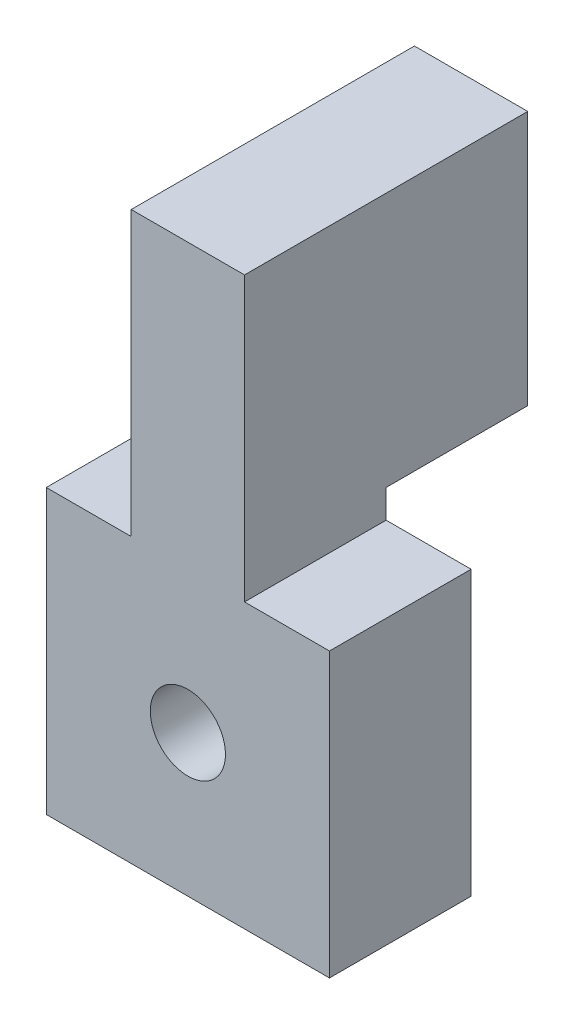
ISO-10303-21;
HEADER;
FILE_DESCRIPTION(('STEP AP214'),'2;1');
FILE_NAME('part.step','',(''),(''),'','','');
FILE_SCHEMA(('AUTOMOTIVE_DESIGN { 1 0 10303 214 1 1 1 1 }'));
ENDSEC;
DATA;
#1=APPLICATION_CONTEXT('core data for automotive mechanical design processes');
#2=APPLICATION_PROTOCOL_DEFINITION('international standard','automotive_design',2000,#1);
#3=PRODUCT_CONTEXT('',#1,'mechanical');
#4=PRODUCT('Part','Part','',(#3));
#5=PRODUCT_RELATED_PRODUCT_CATEGORY('part','',(#4));
#6=PRODUCT_DEFINITION_FORMATION('','',#4);
#7=PRODUCT_DEFINITION_CONTEXT('part definition',#1,'design');
#8=PRODUCT_DEFINITION('design','',#6,#7);
#9=PRODUCT_DEFINITION_SHAPE('','',#8);
#10=(LENGTH_UNIT() NAMED_UNIT(*) SI_UNIT(.MILLI.,.METRE.));
#11=(NAMED_UNIT(*) PLANE_ANGLE_UNIT() SI_UNIT($,.RADIAN.));
#12=(NAMED_UNIT(*) SI_UNIT($,.STERADIAN.) SOLID_ANGLE_UNIT());
#13=UNCERTAINTY_MEASURE_WITH_UNIT(LENGTH_MEASURE(1.E-05),#10,'distance_accuracy_value','');
#14=(GEOMETRIC_REPRESENTATION_CONTEXT(3) GLOBAL_UNCERTAINTY_ASSIGNED_CONTEXT((#13)) GLOBAL_UNIT_ASSIGNED_CONTEXT((#10,
#11,#12)) REPRESENTATION_CONTEXT('',''));
#15=CARTESIAN_POINT('',(0.,0.,0.));
#16=DIRECTION('',(0.,0.,1.));
#17=DIRECTION('',(1.,0.,0.));
#18=AXIS2_PLACEMENT_3D('',#15,#16,#17);
#19=CARTESIAN_POINT('',(10.,0.,10.));
#20=DIRECTION('',(1.,0.,0.));
#21=DIRECTION('',(0.,1.,0.));
#22=AXIS2_PLACEMENT_3D('',#19,#20,#21);
#23=PLANE('',#22);
#24=DIRECTION('',(0.,-1.,0.));
#25=VECTOR('',#24,1.);
#26=CARTESIAN_POINT('',(10.,0.,0.));
#27=LINE('',#26,#25);
#28=CARTESIAN_POINT('',(10.,10.,0.));
#29=VERTEX_POINT('',#28);
#30=CARTESIAN_POINT('',(10.,-10.,0.));
#31=VERTEX_POINT('',#30);
#32=EDGE_CURVE('E164',#29,#31,#27,.T.);
#33=ORIENTED_EDGE('',*,*,#32,.F.);
#34=DIRECTION('',(0.,0.,-1.));
#35=VECTOR('',#34,1.);
#36=CARTESIAN_POINT('',(10.,10.,10.));
#37=LINE('',#36,#35);
#38=CARTESIAN_POINT('',(10.,10.,10.));
#39=VERTEX_POINT('',#38);
#40=EDGE_CURVE('E11',#39,#29,#37,.T.);
#41=ORIENTED_EDGE('',*,*,#40,.F.);
#42=DIRECTION('',(0.,-1.,0.));
#43=VECTOR('',#42,1.);
#44=CARTESIAN_POINT('',(10.,0.,10.));
#45=LINE('',#44,#43);
#46=CARTESIAN_POINT('',(10.,-10.,10.));
#47=VERTEX_POINT('',#46);
#48=EDGE_CURVE('E149',#39,#47,#45,.T.);
#49=ORIENTED_EDGE('',*,*,#48,.T.);
#50=DIRECTION('',(0.,0.,-1.));
#51=VECTOR('',#50,1.);
#52=CARTESIAN_POINT('',(10.,-10.,10.));
#53=LINE('',#52,#51);
#54=EDGE_CURVE('E91',#47,#31,#53,.T.);
#55=ORIENTED_EDGE('',*,*,#54,.T.);
#56=EDGE_LOOP('',(#33,#41,#49,#55));
#57=FACE_BOUND('',#56,.T.);
#58=ADVANCED_FACE('F47',(#57),#23,.T.);
#59=CARTESIAN_POINT('',(0.,10.,10.));
#60=DIRECTION('',(0.,1.,0.));
#61=DIRECTION('',(-1.,0.,0.));
#62=AXIS2_PLACEMENT_3D('',#59,#60,#61);
#63=PLANE('',#62);
#64=DIRECTION('',(1.,0.,0.));
#65=VECTOR('',#64,1.);
#66=CARTESIAN_POINT('',(0.,10.,0.));
#67=LINE('',#66,#65);
#68=CARTESIAN_POINT('',(4.,10.,0.));
#69=VERTEX_POINT('',#68);
#70=EDGE_CURVE('E238',#69,#29,#67,.T.);
#71=ORIENTED_EDGE('',*,*,#70,.F.);
#72=DIRECTION('',(0.,0.,-1.));
#73=VECTOR('',#72,1.);
#74=CARTESIAN_POINT('',(4.,10.,10.));
#75=LINE('',#74,#73);
#76=CARTESIAN_POINT('',(4.,10.,10.));
#77=VERTEX_POINT('',#76);
#78=EDGE_CURVE('E55',#77,#69,#75,.T.);
#79=ORIENTED_EDGE('',*,*,#78,.F.);
#80=DIRECTION('',(1.,0.,0.));
#81=VECTOR('',#80,1.);
#82=CARTESIAN_POINT('',(0.,10.,10.));
#83=LINE('',#82,#81);
#84=EDGE_CURVE('E140',#77,#39,#83,.T.);
#85=ORIENTED_EDGE('',*,*,#84,.T.);
#86=ORIENTED_EDGE('',*,*,#40,.T.);
#87=EDGE_LOOP('',(#71,#79,#85,#86));
#88=FACE_BOUND('',#87,.T.);
#89=ADVANCED_FACE('F239',(#88),#63,.T.);
#90=CARTESIAN_POINT('',(4.,0.,10.));
#91=DIRECTION('',(1.,0.,0.));
#92=DIRECTION('',(0.,1.,0.));
#93=AXIS2_PLACEMENT_3D('',#90,#91,#92);
#94=PLANE('',#93);
#95=DIRECTION('',(0.,-1.,0.));
#96=VECTOR('',#95,1.);
#97=CARTESIAN_POINT('',(4.,10.,0.));
#98=LINE('',#97,#96);
#99=CARTESIAN_POINT('',(4.,12.,0.));
#100=VERTEX_POINT('',#99);
#101=EDGE_CURVE('E181',#100,#69,#98,.T.);
#102=ORIENTED_EDGE('',*,*,#101,.F.);
#103=DIRECTION('',(0.,0.,-1.));
#104=VECTOR('',#103,1.);
#105=CARTESIAN_POINT('',(4.,12.,8.24621125123532));
#106=LINE('',#105,#104);
#107=CARTESIAN_POINT('',(4.,12.,-10.));
#108=VERTEX_POINT('',#107);
#109=EDGE_CURVE('E186',#100,#108,#106,.T.);
#110=ORIENTED_EDGE('',*,*,#109,.T.);
#111=DIRECTION('',(0.,-1.,0.));
#112=VECTOR('',#111,1.);
#113=CARTESIAN_POINT('',(4.,0.,-10.));
#114=LINE('',#113,#112);
#115=CARTESIAN_POINT('',(4.,30.,-10.));
#116=VERTEX_POINT('',#115);
#117=EDGE_CURVE('E177',#116,#108,#114,.T.);
#118=ORIENTED_EDGE('',*,*,#117,.F.);
#119=DIRECTION('',(0.,0.,-1.));
#120=VECTOR('',#119,1.);
#121=CARTESIAN_POINT('',(4.,30.,10.));
#122=LINE('',#121,#120);
#123=CARTESIAN_POINT('',(4.,30.,10.));
#124=VERTEX_POINT('',#123);
#125=EDGE_CURVE('E223',#124,#116,#122,.T.);
#126=ORIENTED_EDGE('',*,*,#125,.F.);
#127=DIRECTION('',(0.,-1.,0.));
#128=VECTOR('',#127,1.);
#129=CARTESIAN_POINT('',(4.,0.,10.));
#130=LINE('',#129,#128);
#131=EDGE_CURVE('E148',#124,#77,#130,.T.);
#132=ORIENTED_EDGE('',*,*,#131,.T.);
#133=ORIENTED_EDGE('',*,*,#78,.T.);
#134=EDGE_LOOP('',(#102,#110,#118,#126,#132,#133));
#135=FACE_BOUND('',#134,.T.);
#136=ADVANCED_FACE('F213',(#135),#94,.T.);
#137=CARTESIAN_POINT('',(0.,30.,10.));
#138=DIRECTION('',(0.,1.,0.));
#139=DIRECTION('',(0.,0.,1.));
#140=AXIS2_PLACEMENT_3D('',#137,#138,#139);
#141=PLANE('',#140);
#142=ORIENTED_EDGE('',*,*,#125,.T.);
#143=DIRECTION('',(1.,0.,0.));
#144=VECTOR('',#143,1.);
#145=CARTESIAN_POINT('',(0.,30.,-10.));
#146=LINE('',#145,#144);
#147=CARTESIAN_POINT('',(-4.,30.,-10.));
#148=VERTEX_POINT('',#147);
#149=EDGE_CURVE('E173',#148,#116,#146,.T.);
#150=ORIENTED_EDGE('',*,*,#149,.F.);
#151=DIRECTION('',(0.,0.,-1.));
#152=VECTOR('',#151,1.);
#153=CARTESIAN_POINT('',(-4.,30.,10.));
#154=LINE('',#153,#152);
#155=CARTESIAN_POINT('',(-4.,30.,10.));
#156=VERTEX_POINT('',#155);
#157=EDGE_CURVE('E222',#156,#148,#154,.T.);
#158=ORIENTED_EDGE('',*,*,#157,.F.);
#159=DIRECTION('',(1.,0.,0.));
#160=VECTOR('',#159,1.);
#161=CARTESIAN_POINT('',(0.,30.,10.));
#162=LINE('',#161,#160);
#163=EDGE_CURVE('E142',#156,#124,#162,.T.);
#164=ORIENTED_EDGE('',*,*,#163,.T.);
#165=EDGE_LOOP('',(#142,#150,#158,#164));
#166=FACE_BOUND('',#165,.T.);
#167=ADVANCED_FACE('F219',(#166),#141,.T.);
#168=CARTESIAN_POINT('',(-4.,0.,10.));
#169=DIRECTION('',(1.,0.,0.));
#170=DIRECTION('',(0.,1.,0.));
#171=AXIS2_PLACEMENT_3D('',#168,#169,#170);
#172=PLANE('',#171);
#173=DIRECTION('',(0.,0.,-1.));
#174=VECTOR('',#173,1.);
#175=CARTESIAN_POINT('',(-4.,12.,8.24621125123532));
#176=LINE('',#175,#174);
#177=CARTESIAN_POINT('',(-4.,12.,0.));
#178=VERTEX_POINT('',#177);
#179=CARTESIAN_POINT('',(-4.,12.,-10.));
#180=VERTEX_POINT('',#179);
#181=EDGE_CURVE('E62',#178,#180,#176,.T.);
#182=ORIENTED_EDGE('',*,*,#181,.F.);
#183=DIRECTION('',(0.,1.,0.));
#184=VECTOR('',#183,1.);
#185=CARTESIAN_POINT('',(-4.,10.,0.));
#186=LINE('',#185,#184);
#187=CARTESIAN_POINT('',(-4.,10.,0.));
#188=VERTEX_POINT('',#187);
#189=EDGE_CURVE('E185',#188,#178,#186,.T.);
#190=ORIENTED_EDGE('',*,*,#189,.F.);
#191=DIRECTION('',(0.,0.,-1.));
#192=VECTOR('',#191,1.);
#193=CARTESIAN_POINT('',(-4.,10.,10.));
#194=LINE('',#193,#192);
#195=CARTESIAN_POINT('',(-4.,10.,10.));
#196=VERTEX_POINT('',#195);
#197=EDGE_CURVE('E124',#196,#188,#194,.T.);
#198=ORIENTED_EDGE('',*,*,#197,.F.);
#199=DIRECTION('',(0.,-1.,0.));
#200=VECTOR('',#199,1.);
#201=CARTESIAN_POINT('',(-4.,0.,10.));
#202=LINE('',#201,#200);
#203=EDGE_CURVE('E136',#156,#196,#202,.T.);
#204=ORIENTED_EDGE('',*,*,#203,.F.);
#205=ORIENTED_EDGE('',*,*,#157,.T.);
#206=DIRECTION('',(0.,-1.,0.));
#207=VECTOR('',#206,1.);
#208=CARTESIAN_POINT('',(-4.,0.,-10.));
#209=LINE('',#208,#207);
#210=EDGE_CURVE('E169',#148,#180,#209,.T.);
#211=ORIENTED_EDGE('',*,*,#210,.T.);
#212=EDGE_LOOP('',(#182,#190,#198,#204,#205,#211));
#213=FACE_BOUND('',#212,.T.);
#214=ADVANCED_FACE('F225',(#213),#172,.F.);
#215=CARTESIAN_POINT('',(-10.,10.,0.));
#216=VERTEX_POINT('',#215);
#217=EDGE_CURVE('E120',#216,#188,#67,.T.);
#218=ORIENTED_EDGE('',*,*,#217,.F.);
#219=DIRECTION('',(0.,0.,-1.));
#220=VECTOR('',#219,1.);
#221=CARTESIAN_POINT('',(-10.,10.,10.));
#222=LINE('',#221,#220);
#223=CARTESIAN_POINT('',(-10.,10.,10.));
#224=VERTEX_POINT('',#223);
#225=EDGE_CURVE('E113',#224,#216,#222,.T.);
#226=ORIENTED_EDGE('',*,*,#225,.F.);
#227=EDGE_CURVE('E118',#224,#196,#83,.T.);
#228=ORIENTED_EDGE('',*,*,#227,.T.);
#229=ORIENTED_EDGE('',*,*,#197,.T.);
#230=EDGE_LOOP('',(#218,#226,#228,#229));
#231=FACE_BOUND('',#230,.T.);
#232=ADVANCED_FACE('F115',(#231),#63,.T.);
#233=CARTESIAN_POINT('',(-10.,0.,10.));
#234=DIRECTION('',(1.,0.,0.));
#235=DIRECTION('',(0.,0.,-1.));
#236=AXIS2_PLACEMENT_3D('',#233,#234,#235);
#237=PLANE('',#236);
#238=DIRECTION('',(0.,-1.,0.));
#239=VECTOR('',#238,1.);
#240=CARTESIAN_POINT('',(-10.,0.,0.));
#241=LINE('',#240,#239);
#242=CARTESIAN_POINT('',(-10.,-10.,0.));
#243=VERTEX_POINT('',#242);
#244=EDGE_CURVE('E157',#216,#243,#241,.T.);
#245=ORIENTED_EDGE('',*,*,#244,.T.);
#246=DIRECTION('',(0.,0.,-1.));
#247=VECTOR('',#246,1.);
#248=CARTESIAN_POINT('',(-10.,-10.,10.));
#249=LINE('',#248,#247);
#250=CARTESIAN_POINT('',(-10.,-10.,10.));
#251=VERTEX_POINT('',#250);
#252=EDGE_CURVE('E125',#251,#243,#249,.T.);
#253=ORIENTED_EDGE('',*,*,#252,.F.);
#254=DIRECTION('',(0.,-1.,0.));
#255=VECTOR('',#254,1.);
#256=CARTESIAN_POINT('',(-10.,0.,10.));
#257=LINE('',#256,#255);
#258=EDGE_CURVE('E128',#224,#251,#257,.T.);
#259=ORIENTED_EDGE('',*,*,#258,.F.);
#260=ORIENTED_EDGE('',*,*,#225,.T.);
#261=EDGE_LOOP('',(#245,#253,#259,#260));
#262=FACE_BOUND('',#261,.T.);
#263=ADVANCED_FACE('F129',(#262),#237,.F.);
#264=CARTESIAN_POINT('',(0.,-10.,10.));
#265=DIRECTION('',(0.,1.,0.));
#266=DIRECTION('',(0.,0.,1.));
#267=AXIS2_PLACEMENT_3D('',#264,#265,#266);
#268=PLANE('',#267);
#269=DIRECTION('',(1.,0.,0.));
#270=VECTOR('',#269,1.);
#271=CARTESIAN_POINT('',(0.,-10.,0.));
#272=LINE('',#271,#270);
#273=EDGE_CURVE('E155',#243,#31,#272,.T.);
#274=ORIENTED_EDGE('',*,*,#273,.T.);
#275=ORIENTED_EDGE('',*,*,#54,.F.);
#276=DIRECTION('',(1.,0.,0.));
#277=VECTOR('',#276,1.);
#278=CARTESIAN_POINT('',(0.,-10.,10.));
#279=LINE('',#278,#277);
#280=EDGE_CURVE('E71',#251,#47,#279,.T.);
#281=ORIENTED_EDGE('',*,*,#280,.F.);
#282=ORIENTED_EDGE('',*,*,#252,.T.);
#283=EDGE_LOOP('',(#274,#275,#281,#282));
#284=FACE_BOUND('',#283,.T.);
#285=ADVANCED_FACE('F256',(#284),#268,.F.);
#286=CARTESIAN_POINT('',(0.,0.,10.));
#287=DIRECTION('',(0.,0.,1.));
#288=DIRECTION('',(1.,0.,0.));
#289=AXIS2_PLACEMENT_3D('',#286,#287,#288);
#290=PLANE('',#289);
#291=CARTESIAN_POINT('',(0.,0.,10.));
#292=DIRECTION('',(0.,0.,1.));
#293=DIRECTION('',(1.,0.,0.));
#294=AXIS2_PLACEMENT_3D('',#291,#292,#293);
#295=CIRCLE('',#294,2.65429999999998);
#296=CARTESIAN_POINT('',(2.65429999999998,0.,10.));
#297=VERTEX_POINT('',#296);
#298=EDGE_CURVE('E165',#297,#297,#295,.T.);
#299=ORIENTED_EDGE('',*,*,#298,.F.);
#300=EDGE_LOOP('',(#299));
#301=FACE_BOUND('',#300,.T.);
#302=ORIENTED_EDGE('',*,*,#48,.F.);
#303=ORIENTED_EDGE('',*,*,#84,.F.);
#304=ORIENTED_EDGE('',*,*,#131,.F.);
#305=ORIENTED_EDGE('',*,*,#163,.F.);
#306=ORIENTED_EDGE('',*,*,#203,.T.);
#307=ORIENTED_EDGE('',*,*,#227,.F.);
#308=ORIENTED_EDGE('',*,*,#258,.T.);
#309=ORIENTED_EDGE('',*,*,#280,.T.);
#310=EDGE_LOOP('',(#302,#303,#304,#305,#306,#307,#308,#309));
#311=FACE_BOUND('',#310,.T.);
#312=ADVANCED_FACE('F133',(#301,#311),#290,.T.);
#313=CARTESIAN_POINT('',(0.,0.,0.));
#314=DIRECTION('',(0.,0.,1.));
#315=DIRECTION('',(1.,0.,0.));
#316=AXIS2_PLACEMENT_3D('',#313,#314,#315);
#317=PLANE('',#316);
#318=CARTESIAN_POINT('',(0.,0.,0.));
#319=DIRECTION('',(0.,0.,1.));
#320=DIRECTION('',(1.,0.,0.));
#321=AXIS2_PLACEMENT_3D('',#318,#319,#320);
#322=CIRCLE('',#321,2.65429999999998);
#323=CARTESIAN_POINT('',(2.65429999999998,0.,0.));
#324=VERTEX_POINT('',#323);
#325=EDGE_CURVE('E160',#324,#324,#322,.T.);
#326=ORIENTED_EDGE('',*,*,#325,.T.);
#327=EDGE_LOOP('',(#326));
#328=FACE_BOUND('',#327,.T.);
#329=ORIENTED_EDGE('',*,*,#217,.T.);
#330=ORIENTED_EDGE('',*,*,#189,.T.);
#331=DIRECTION('',(1.,0.,0.));
#332=VECTOR('',#331,1.);
#333=CARTESIAN_POINT('',(4.,12.,0.));
#334=LINE('',#333,#332);
#335=EDGE_CURVE('E184',#178,#100,#334,.T.);
#336=ORIENTED_EDGE('',*,*,#335,.T.);
#337=ORIENTED_EDGE('',*,*,#101,.T.);
#338=ORIENTED_EDGE('',*,*,#70,.T.);
#339=ORIENTED_EDGE('',*,*,#32,.T.);
#340=ORIENTED_EDGE('',*,*,#273,.F.);
#341=ORIENTED_EDGE('',*,*,#244,.F.);
#342=EDGE_LOOP('',(#329,#330,#336,#337,#338,#339,#340,#341));
#343=FACE_BOUND('',#342,.T.);
#344=ADVANCED_FACE('F257',(#328,#343),#317,.F.);
#345=CARTESIAN_POINT('',(0.,0.,10.));
#346=DIRECTION('',(0.,0.,1.));
#347=DIRECTION('',(1.,0.,0.));
#348=AXIS2_PLACEMENT_3D('',#345,#346,#347);
#349=CYLINDRICAL_SURFACE('',#348,2.65429999999998);
#350=ORIENTED_EDGE('',*,*,#325,.F.);
#351=EDGE_LOOP('',(#350));
#352=FACE_BOUND('',#351,.T.);
#353=ORIENTED_EDGE('',*,*,#298,.T.);
#354=EDGE_LOOP('',(#353));
#355=FACE_BOUND('',#354,.T.);
#356=ADVANCED_FACE('F285',(#352,#355),#349,.F.);
#357=CARTESIAN_POINT('',(0.,0.,-10.));
#358=DIRECTION('',(0.,0.,1.));
#359=DIRECTION('',(1.,0.,0.));
#360=AXIS2_PLACEMENT_3D('',#357,#358,#359);
#361=PLANE('',#360);
#362=ORIENTED_EDGE('',*,*,#117,.T.);
#363=DIRECTION('',(1.,0.,0.));
#364=VECTOR('',#363,1.);
#365=CARTESIAN_POINT('',(4.,12.,-10.));
#366=LINE('',#365,#364);
#367=EDGE_CURVE('E193',#180,#108,#366,.T.);
#368=ORIENTED_EDGE('',*,*,#367,.F.);
#369=ORIENTED_EDGE('',*,*,#210,.F.);
#370=ORIENTED_EDGE('',*,*,#149,.T.);
#371=EDGE_LOOP('',(#362,#368,#369,#370));
#372=FACE_BOUND('',#371,.T.);
#373=ADVANCED_FACE('F215',(#372),#361,.F.);
#374=CARTESIAN_POINT('',(4.,12.,8.24621125123532));
#375=DIRECTION('',(0.,1.,0.));
#376=DIRECTION('',(0.,0.,1.));
#377=AXIS2_PLACEMENT_3D('',#374,#375,#376);
#378=PLANE('',#377);
#379=ORIENTED_EDGE('',*,*,#181,.T.);
#380=ORIENTED_EDGE('',*,*,#367,.T.);
#381=ORIENTED_EDGE('',*,*,#109,.F.);
#382=ORIENTED_EDGE('',*,*,#335,.F.);
#383=EDGE_LOOP('',(#379,#380,#381,#382));
#384=FACE_BOUND('',#383,.T.);
#385=ADVANCED_FACE('F203',(#384),#378,.F.);
#386=CLOSED_SHELL('',(#58,#89,#136,#167,#214,#232,#263,#285,#312,#344,#356,#373,#385));
#387=MANIFOLD_SOLID_BREP('B2',#386);
#388=ADVANCED_BREP_SHAPE_REPRESENTATION('',(#18,#387),#14);
#389=SHAPE_DEFINITION_REPRESENTATION(#9,#388);
ENDSEC;
END-ISO-10303-21;
